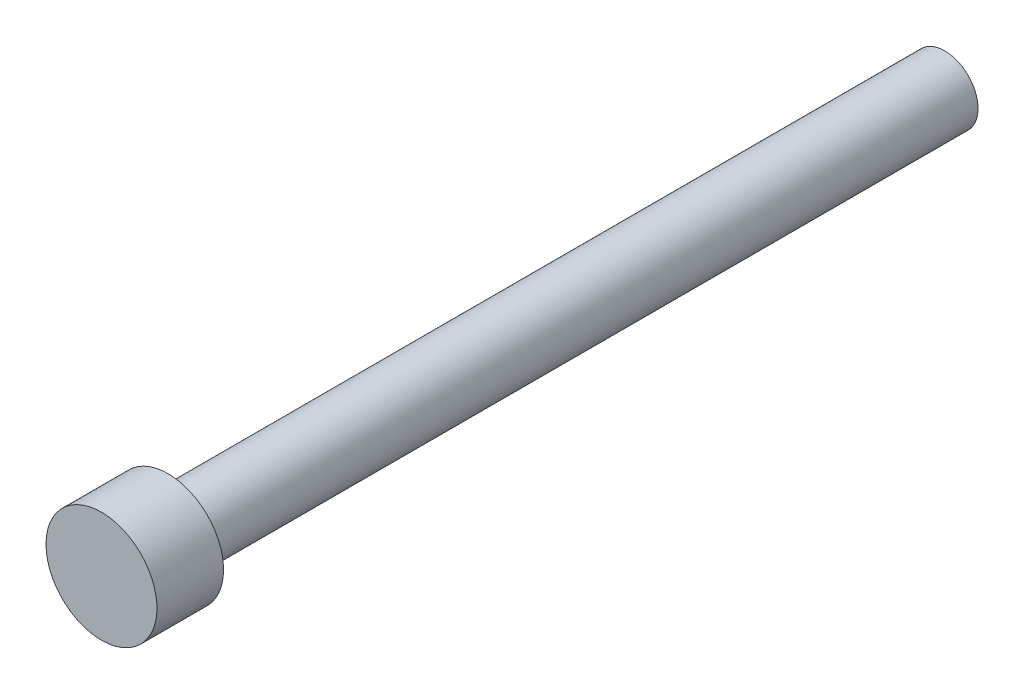
ISO-10303-21;
HEADER;
FILE_DESCRIPTION(('STEP AP214'),'2;1');
FILE_NAME('part.step','',(''),(''),'','','');
FILE_SCHEMA(('AUTOMOTIVE_DESIGN { 1 0 10303 214 1 1 1 1 }'));
ENDSEC;
DATA;
#1=APPLICATION_CONTEXT('core data for automotive mechanical design processes');
#2=APPLICATION_PROTOCOL_DEFINITION('international standard','automotive_design',2000,#1);
#3=PRODUCT_CONTEXT('',#1,'mechanical');
#4=PRODUCT('Part','Part','',(#3));
#5=PRODUCT_RELATED_PRODUCT_CATEGORY('part','',(#4));
#6=PRODUCT_DEFINITION_FORMATION('','',#4);
#7=PRODUCT_DEFINITION_CONTEXT('part definition',#1,'design');
#8=PRODUCT_DEFINITION('design','',#6,#7);
#9=PRODUCT_DEFINITION_SHAPE('','',#8);
#10=(LENGTH_UNIT() NAMED_UNIT(*) SI_UNIT(.MILLI.,.METRE.));
#11=(NAMED_UNIT(*) PLANE_ANGLE_UNIT() SI_UNIT($,.RADIAN.));
#12=(NAMED_UNIT(*) SI_UNIT($,.STERADIAN.) SOLID_ANGLE_UNIT());
#13=UNCERTAINTY_MEASURE_WITH_UNIT(LENGTH_MEASURE(1.E-05),#10,'distance_accuracy_value','');
#14=(GEOMETRIC_REPRESENTATION_CONTEXT(3) GLOBAL_UNCERTAINTY_ASSIGNED_CONTEXT((#13)) GLOBAL_UNIT_ASSIGNED_CONTEXT((#10,
#11,#12)) REPRESENTATION_CONTEXT('',''));
#15=CARTESIAN_POINT('',(0.,0.,0.));
#16=DIRECTION('',(0.,0.,1.));
#17=DIRECTION('',(1.,0.,0.));
#18=AXIS2_PLACEMENT_3D('',#15,#16,#17);
#19=CARTESIAN_POINT('',(0.,0.,6.));
#20=DIRECTION('',(0.,0.,-1.));
#21=DIRECTION('',(-1.,0.,0.));
#22=AXIS2_PLACEMENT_3D('',#19,#20,#21);
#23=PLANE('',#22);
#24=CARTESIAN_POINT('',(0.,0.,6.00000000000001));
#25=DIRECTION('',(0.,0.,-1.));
#26=DIRECTION('',(-1.,0.,0.));
#27=AXIS2_PLACEMENT_3D('',#24,#25,#26);
#28=CIRCLE('',#27,5.);
#29=CARTESIAN_POINT('',(-5.,0.,6.00000000000001));
#30=VERTEX_POINT('',#29);
#31=EDGE_CURVE('E10',#30,#30,#28,.T.);
#32=ORIENTED_EDGE('',*,*,#31,.F.);
#33=EDGE_LOOP('',(#32));
#34=FACE_BOUND('',#33,.T.);
#35=ADVANCED_FACE('F34',(#34),#23,.F.);
#36=CARTESIAN_POINT('',(0.,0.,-70.));
#37=DIRECTION('',(0.,0.,-1.));
#38=DIRECTION('',(-1.,0.,0.));
#39=AXIS2_PLACEMENT_3D('',#36,#37,#38);
#40=CYLINDRICAL_SURFACE('',#39,5.);
#41=CARTESIAN_POINT('',(0.,0.,0.));
#42=DIRECTION('',(0.,0.,-1.));
#43=DIRECTION('',(-1.,0.,0.));
#44=AXIS2_PLACEMENT_3D('',#41,#42,#43);
#45=CIRCLE('',#44,5.);
#46=CARTESIAN_POINT('',(-5.,0.,0.));
#47=VERTEX_POINT('',#46);
#48=EDGE_CURVE('E45',#47,#47,#45,.T.);
#49=ORIENTED_EDGE('',*,*,#48,.F.);
#50=EDGE_LOOP('',(#49));
#51=FACE_BOUND('',#50,.T.);
#52=ORIENTED_EDGE('',*,*,#31,.T.);
#53=EDGE_LOOP('',(#52));
#54=FACE_BOUND('',#53,.T.);
#55=ADVANCED_FACE('F75',(#51,#54),#40,.T.);
#56=CARTESIAN_POINT('',(5.,0.,0.));
#57=DIRECTION('',(0.,0.,1.));
#58=DIRECTION('',(1.,0.,0.));
#59=AXIS2_PLACEMENT_3D('',#56,#57,#58);
#60=PLANE('',#59);
#61=CARTESIAN_POINT('',(0.,0.,0.));
#62=DIRECTION('',(0.,0.,-1.));
#63=DIRECTION('',(-1.,0.,0.));
#64=AXIS2_PLACEMENT_3D('',#61,#62,#63);
#65=CIRCLE('',#64,3.);
#66=CARTESIAN_POINT('',(-3.,0.,0.));
#67=VERTEX_POINT('',#66);
#68=EDGE_CURVE('E48',#67,#67,#65,.T.);
#69=ORIENTED_EDGE('',*,*,#68,.F.);
#70=EDGE_LOOP('',(#69));
#71=FACE_BOUND('',#70,.T.);
#72=ORIENTED_EDGE('',*,*,#48,.T.);
#73=EDGE_LOOP('',(#72));
#74=FACE_BOUND('',#73,.T.);
#75=ADVANCED_FACE('F67',(#71,#74),#60,.F.);
#76=CARTESIAN_POINT('',(0.,0.,-70.));
#77=DIRECTION('',(0.,0.,-1.));
#78=DIRECTION('',(-1.,0.,0.));
#79=AXIS2_PLACEMENT_3D('',#76,#77,#78);
#80=CYLINDRICAL_SURFACE('',#79,3.);
#81=CARTESIAN_POINT('',(0.,0.,-70.));
#82=DIRECTION('',(0.,0.,-1.));
#83=DIRECTION('',(-1.,0.,0.));
#84=AXIS2_PLACEMENT_3D('',#81,#82,#83);
#85=CIRCLE('',#84,3.);
#86=CARTESIAN_POINT('',(-3.,0.,-70.));
#87=VERTEX_POINT('',#86);
#88=EDGE_CURVE('E53',#87,#87,#85,.T.);
#89=ORIENTED_EDGE('',*,*,#88,.F.);
#90=EDGE_LOOP('',(#89));
#91=FACE_BOUND('',#90,.T.);
#92=ORIENTED_EDGE('',*,*,#68,.T.);
#93=EDGE_LOOP('',(#92));
#94=FACE_BOUND('',#93,.T.);
#95=ADVANCED_FACE('F61',(#91,#94),#80,.T.);
#96=CARTESIAN_POINT('',(3.,0.,-70.));
#97=DIRECTION('',(0.,0.,1.));
#98=DIRECTION('',(1.,0.,0.));
#99=AXIS2_PLACEMENT_3D('',#96,#97,#98);
#100=PLANE('',#99);
#101=ORIENTED_EDGE('',*,*,#88,.T.);
#102=EDGE_LOOP('',(#101));
#103=FACE_BOUND('',#102,.T.);
#104=ADVANCED_FACE('F65',(#103),#100,.F.);
#105=CLOSED_SHELL('',(#35,#55,#75,#95,#104));
#106=MANIFOLD_SOLID_BREP('B2',#105);
#107=ADVANCED_BREP_SHAPE_REPRESENTATION('',(#18,#106),#14);
#108=SHAPE_DEFINITION_REPRESENTATION(#9,#107);
ENDSEC;
END-ISO-10303-21;
